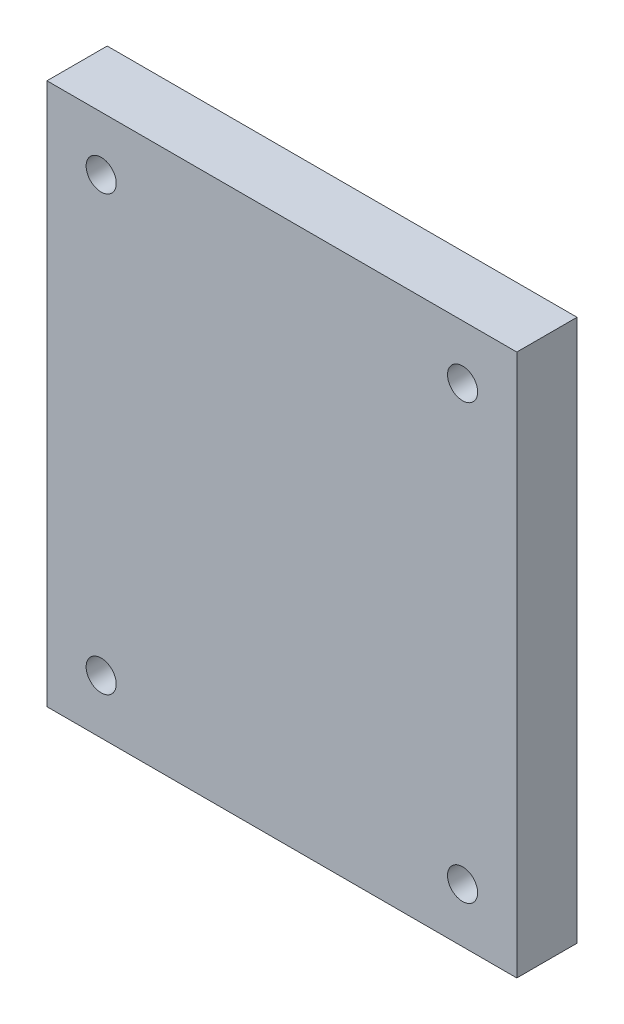
ISO-10303-21;
HEADER;
FILE_DESCRIPTION(('STEP AP214'),'2;1');
FILE_NAME('part.step','',(''),(''),'','','');
FILE_SCHEMA(('AUTOMOTIVE_DESIGN { 1 0 10303 214 1 1 1 1 }'));
ENDSEC;
DATA;
#1=APPLICATION_CONTEXT('core data for automotive mechanical design processes');
#2=APPLICATION_PROTOCOL_DEFINITION('international standard','automotive_design',2000,#1);
#3=PRODUCT_CONTEXT('',#1,'mechanical');
#4=PRODUCT('Part','Part','',(#3));
#5=PRODUCT_RELATED_PRODUCT_CATEGORY('part','',(#4));
#6=PRODUCT_DEFINITION_FORMATION('','',#4);
#7=PRODUCT_DEFINITION_CONTEXT('part definition',#1,'design');
#8=PRODUCT_DEFINITION('design','',#6,#7);
#9=PRODUCT_DEFINITION_SHAPE('','',#8);
#10=(LENGTH_UNIT() NAMED_UNIT(*) SI_UNIT(.MILLI.,.METRE.));
#11=(NAMED_UNIT(*) PLANE_ANGLE_UNIT() SI_UNIT($,.RADIAN.));
#12=(NAMED_UNIT(*) SI_UNIT($,.STERADIAN.) SOLID_ANGLE_UNIT());
#13=UNCERTAINTY_MEASURE_WITH_UNIT(LENGTH_MEASURE(1.E-05),#10,'distance_accuracy_value','');
#14=(GEOMETRIC_REPRESENTATION_CONTEXT(3) GLOBAL_UNCERTAINTY_ASSIGNED_CONTEXT((#13)) GLOBAL_UNIT_ASSIGNED_CONTEXT((#10,
#11,#12)) REPRESENTATION_CONTEXT('',''));
#15=CARTESIAN_POINT('',(0.,0.,0.));
#16=DIRECTION('',(0.,0.,1.));
#17=DIRECTION('',(1.,0.,0.));
#18=AXIS2_PLACEMENT_3D('',#15,#16,#17);
#19=CARTESIAN_POINT('',(19.5,0.,5.));
#20=DIRECTION('',(1.,0.,0.));
#21=DIRECTION('',(0.,0.,-1.));
#22=AXIS2_PLACEMENT_3D('',#19,#20,#21);
#23=PLANE('',#22);
#24=DIRECTION('',(0.,-1.,0.));
#25=VECTOR('',#24,1.);
#26=CARTESIAN_POINT('',(19.5,0.,0.));
#27=LINE('',#26,#25);
#28=CARTESIAN_POINT('',(19.5,22.5,0.));
#29=VERTEX_POINT('',#28);
#30=CARTESIAN_POINT('',(19.5,-22.5,0.));
#31=VERTEX_POINT('',#30);
#32=EDGE_CURVE('E113',#29,#31,#27,.T.);
#33=ORIENTED_EDGE('',*,*,#32,.F.);
#34=DIRECTION('',(0.,0.,-1.));
#35=VECTOR('',#34,1.);
#36=CARTESIAN_POINT('',(19.5,22.5,5.));
#37=LINE('',#36,#35);
#38=CARTESIAN_POINT('',(19.5,22.5,5.));
#39=VERTEX_POINT('',#38);
#40=EDGE_CURVE('E11',#39,#29,#37,.T.);
#41=ORIENTED_EDGE('',*,*,#40,.F.);
#42=DIRECTION('',(0.,-1.,0.));
#43=VECTOR('',#42,1.);
#44=CARTESIAN_POINT('',(19.5,0.,5.));
#45=LINE('',#44,#43);
#46=CARTESIAN_POINT('',(19.5,-22.5,5.));
#47=VERTEX_POINT('',#46);
#48=EDGE_CURVE('E94',#39,#47,#45,.T.);
#49=ORIENTED_EDGE('',*,*,#48,.T.);
#50=DIRECTION('',(0.,0.,-1.));
#51=VECTOR('',#50,1.);
#52=CARTESIAN_POINT('',(19.5,-22.5,5.));
#53=LINE('',#52,#51);
#54=EDGE_CURVE('E72',#47,#31,#53,.T.);
#55=ORIENTED_EDGE('',*,*,#54,.T.);
#56=EDGE_LOOP('',(#33,#41,#49,#55));
#57=FACE_BOUND('',#56,.T.);
#58=ADVANCED_FACE('F32',(#57),#23,.T.);
#59=CARTESIAN_POINT('',(0.,22.5,5.));
#60=DIRECTION('',(0.,1.,0.));
#61=DIRECTION('',(0.,0.,1.));
#62=AXIS2_PLACEMENT_3D('',#59,#60,#61);
#63=PLANE('',#62);
#64=DIRECTION('',(1.,0.,0.));
#65=VECTOR('',#64,1.);
#66=CARTESIAN_POINT('',(0.,22.5,0.));
#67=LINE('',#66,#65);
#68=CARTESIAN_POINT('',(-19.5,22.5,0.));
#69=VERTEX_POINT('',#68);
#70=EDGE_CURVE('E84',#69,#29,#67,.T.);
#71=ORIENTED_EDGE('',*,*,#70,.F.);
#72=DIRECTION('',(0.,0.,-1.));
#73=VECTOR('',#72,1.);
#74=CARTESIAN_POINT('',(-19.5,22.5,5.));
#75=LINE('',#74,#73);
#76=CARTESIAN_POINT('',(-19.5,22.5,5.));
#77=VERTEX_POINT('',#76);
#78=EDGE_CURVE('E41',#77,#69,#75,.T.);
#79=ORIENTED_EDGE('',*,*,#78,.F.);
#80=DIRECTION('',(1.,0.,0.));
#81=VECTOR('',#80,1.);
#82=CARTESIAN_POINT('',(0.,22.5,5.));
#83=LINE('',#82,#81);
#84=EDGE_CURVE('E82',#77,#39,#83,.T.);
#85=ORIENTED_EDGE('',*,*,#84,.T.);
#86=ORIENTED_EDGE('',*,*,#40,.T.);
#87=EDGE_LOOP('',(#71,#79,#85,#86));
#88=FACE_BOUND('',#87,.T.);
#89=ADVANCED_FACE('F80',(#88),#63,.T.);
#90=CARTESIAN_POINT('',(-19.5,0.,5.));
#91=DIRECTION('',(1.,0.,0.));
#92=DIRECTION('',(0.,0.,-1.));
#93=AXIS2_PLACEMENT_3D('',#90,#91,#92);
#94=PLANE('',#93);
#95=DIRECTION('',(0.,-1.,0.));
#96=VECTOR('',#95,1.);
#97=CARTESIAN_POINT('',(-19.5,0.,0.));
#98=LINE('',#97,#96);
#99=CARTESIAN_POINT('',(-19.5,-22.5,0.));
#100=VERTEX_POINT('',#99);
#101=EDGE_CURVE('E116',#69,#100,#98,.T.);
#102=ORIENTED_EDGE('',*,*,#101,.T.);
#103=DIRECTION('',(0.,0.,-1.));
#104=VECTOR('',#103,1.);
#105=CARTESIAN_POINT('',(-19.5,-22.5,5.));
#106=LINE('',#105,#104);
#107=CARTESIAN_POINT('',(-19.5,-22.5,5.));
#108=VERTEX_POINT('',#107);
#109=EDGE_CURVE('E87',#108,#100,#106,.T.);
#110=ORIENTED_EDGE('',*,*,#109,.F.);
#111=DIRECTION('',(0.,-1.,0.));
#112=VECTOR('',#111,1.);
#113=CARTESIAN_POINT('',(-19.5,0.,5.));
#114=LINE('',#113,#112);
#115=EDGE_CURVE('E89',#77,#108,#114,.T.);
#116=ORIENTED_EDGE('',*,*,#115,.F.);
#117=ORIENTED_EDGE('',*,*,#78,.T.);
#118=EDGE_LOOP('',(#102,#110,#116,#117));
#119=FACE_BOUND('',#118,.T.);
#120=ADVANCED_FACE('F90',(#119),#94,.F.);
#121=CARTESIAN_POINT('',(14.9999999999999,-18.,5.));
#122=DIRECTION('',(0.,0.,-1.));
#123=DIRECTION('',(-1.,0.,0.));
#124=AXIS2_PLACEMENT_3D('',#121,#122,#123);
#125=CYLINDRICAL_SURFACE('',#124,1.25);
#126=CARTESIAN_POINT('',(14.9999999999999,-18.,5.));
#127=DIRECTION('',(0.,0.,1.));
#128=DIRECTION('',(1.,0.,0.));
#129=AXIS2_PLACEMENT_3D('',#126,#127,#128);
#130=CIRCLE('',#129,1.25);
#131=CARTESIAN_POINT('',(16.2499999999999,-18.,5.));
#132=VERTEX_POINT('',#131);
#133=EDGE_CURVE('E101',#132,#132,#130,.T.);
#134=ORIENTED_EDGE('',*,*,#133,.T.);
#135=EDGE_LOOP('',(#134));
#136=FACE_BOUND('',#135,.T.);
#137=CARTESIAN_POINT('',(14.9999999999999,-18.,0.));
#138=DIRECTION('',(0.,0.,1.));
#139=DIRECTION('',(1.,0.,0.));
#140=AXIS2_PLACEMENT_3D('',#137,#138,#139);
#141=CIRCLE('',#140,1.25);
#142=CARTESIAN_POINT('',(16.2499999999999,-18.,0.));
#143=VERTEX_POINT('',#142);
#144=EDGE_CURVE('E119',#143,#143,#141,.T.);
#145=ORIENTED_EDGE('',*,*,#144,.F.);
#146=EDGE_LOOP('',(#145));
#147=FACE_BOUND('',#146,.T.);
#148=ADVANCED_FACE('F147',(#136,#147),#125,.F.);
#149=CARTESIAN_POINT('',(0.,-22.5,5.));
#150=DIRECTION('',(0.,1.,0.));
#151=DIRECTION('',(0.,0.,1.));
#152=AXIS2_PLACEMENT_3D('',#149,#150,#151);
#153=PLANE('',#152);
#154=DIRECTION('',(1.,0.,0.));
#155=VECTOR('',#154,1.);
#156=CARTESIAN_POINT('',(0.,-22.5,0.));
#157=LINE('',#156,#155);
#158=EDGE_CURVE('E65',#100,#31,#157,.T.);
#159=ORIENTED_EDGE('',*,*,#158,.T.);
#160=ORIENTED_EDGE('',*,*,#54,.F.);
#161=DIRECTION('',(1.,0.,0.));
#162=VECTOR('',#161,1.);
#163=CARTESIAN_POINT('',(0.,-22.5,5.));
#164=LINE('',#163,#162);
#165=EDGE_CURVE('E49',#108,#47,#164,.T.);
#166=ORIENTED_EDGE('',*,*,#165,.F.);
#167=ORIENTED_EDGE('',*,*,#109,.T.);
#168=EDGE_LOOP('',(#159,#160,#166,#167));
#169=FACE_BOUND('',#168,.T.);
#170=ADVANCED_FACE('F128',(#169),#153,.F.);
#171=CARTESIAN_POINT('',(-15.,18.,5.));
#172=DIRECTION('',(0.,0.,-1.));
#173=DIRECTION('',(-1.,0.,0.));
#174=AXIS2_PLACEMENT_3D('',#171,#172,#173);
#175=CYLINDRICAL_SURFACE('',#174,1.25);
#176=CARTESIAN_POINT('',(-15.,18.,5.));
#177=DIRECTION('',(0.,0.,1.));
#178=DIRECTION('',(1.,0.,0.));
#179=AXIS2_PLACEMENT_3D('',#176,#177,#178);
#180=CIRCLE('',#179,1.25);
#181=CARTESIAN_POINT('',(-13.75,18.,5.));
#182=VERTEX_POINT('',#181);
#183=EDGE_CURVE('E96',#182,#182,#180,.T.);
#184=ORIENTED_EDGE('',*,*,#183,.T.);
#185=EDGE_LOOP('',(#184));
#186=FACE_BOUND('',#185,.T.);
#187=CARTESIAN_POINT('',(-15.,18.,0.));
#188=DIRECTION('',(0.,0.,1.));
#189=DIRECTION('',(1.,0.,0.));
#190=AXIS2_PLACEMENT_3D('',#187,#188,#189);
#191=CIRCLE('',#190,1.25);
#192=CARTESIAN_POINT('',(-13.75,18.,0.));
#193=VERTEX_POINT('',#192);
#194=EDGE_CURVE('E110',#193,#193,#191,.T.);
#195=ORIENTED_EDGE('',*,*,#194,.F.);
#196=EDGE_LOOP('',(#195));
#197=FACE_BOUND('',#196,.T.);
#198=ADVANCED_FACE('F138',(#186,#197),#175,.F.);
#199=CARTESIAN_POINT('',(14.9999999999999,18.,5.));
#200=DIRECTION('',(0.,0.,-1.));
#201=DIRECTION('',(-1.,0.,0.));
#202=AXIS2_PLACEMENT_3D('',#199,#200,#201);
#203=CYLINDRICAL_SURFACE('',#202,1.25);
#204=CARTESIAN_POINT('',(14.9999999999999,18.,5.));
#205=DIRECTION('',(0.,0.,1.));
#206=DIRECTION('',(1.,0.,0.));
#207=AXIS2_PLACEMENT_3D('',#204,#205,#206);
#208=CIRCLE('',#207,1.25);
#209=CARTESIAN_POINT('',(16.2499999999999,18.,5.));
#210=VERTEX_POINT('',#209);
#211=EDGE_CURVE('E125',#210,#210,#208,.F.);
#212=ORIENTED_EDGE('',*,*,#211,.F.);
#213=EDGE_LOOP('',(#212));
#214=FACE_BOUND('',#213,.T.);
#215=CARTESIAN_POINT('',(14.9999999999999,18.,0.));
#216=DIRECTION('',(0.,0.,1.));
#217=DIRECTION('',(1.,0.,0.));
#218=AXIS2_PLACEMENT_3D('',#215,#216,#217);
#219=CIRCLE('',#218,1.25);
#220=CARTESIAN_POINT('',(16.2499999999999,18.,0.));
#221=VERTEX_POINT('',#220);
#222=EDGE_CURVE('E107',#221,#221,#219,.F.);
#223=ORIENTED_EDGE('',*,*,#222,.T.);
#224=EDGE_LOOP('',(#223));
#225=FACE_BOUND('',#224,.T.);
#226=ADVANCED_FACE('F34',(#214,#225),#203,.F.);
#227=CARTESIAN_POINT('',(-15.,-18.,5.));
#228=DIRECTION('',(0.,0.,-1.));
#229=DIRECTION('',(-1.,0.,0.));
#230=AXIS2_PLACEMENT_3D('',#227,#228,#229);
#231=CYLINDRICAL_SURFACE('',#230,1.25);
#232=CARTESIAN_POINT('',(-15.,-18.,5.));
#233=DIRECTION('',(0.,0.,1.));
#234=DIRECTION('',(1.,0.,0.));
#235=AXIS2_PLACEMENT_3D('',#232,#233,#234);
#236=CIRCLE('',#235,1.25);
#237=CARTESIAN_POINT('',(-13.75,-18.,5.));
#238=VERTEX_POINT('',#237);
#239=EDGE_CURVE('E104',#238,#238,#236,.F.);
#240=ORIENTED_EDGE('',*,*,#239,.F.);
#241=EDGE_LOOP('',(#240));
#242=FACE_BOUND('',#241,.T.);
#243=CARTESIAN_POINT('',(-15.,-18.,0.));
#244=DIRECTION('',(0.,0.,1.));
#245=DIRECTION('',(1.,0.,0.));
#246=AXIS2_PLACEMENT_3D('',#243,#244,#245);
#247=CIRCLE('',#246,1.25);
#248=CARTESIAN_POINT('',(-13.75,-18.,0.));
#249=VERTEX_POINT('',#248);
#250=EDGE_CURVE('E122',#249,#249,#247,.F.);
#251=ORIENTED_EDGE('',*,*,#250,.T.);
#252=EDGE_LOOP('',(#251));
#253=FACE_BOUND('',#252,.T.);
#254=ADVANCED_FACE('F145',(#242,#253),#231,.F.);
#255=CARTESIAN_POINT('',(0.,0.,5.));
#256=DIRECTION('',(0.,0.,1.));
#257=DIRECTION('',(1.,0.,0.));
#258=AXIS2_PLACEMENT_3D('',#255,#256,#257);
#259=PLANE('',#258);
#260=ORIENTED_EDGE('',*,*,#211,.T.);
#261=EDGE_LOOP('',(#260));
#262=FACE_BOUND('',#261,.T.);
#263=ORIENTED_EDGE('',*,*,#183,.F.);
#264=EDGE_LOOP('',(#263));
#265=FACE_BOUND('',#264,.T.);
#266=ORIENTED_EDGE('',*,*,#48,.F.);
#267=ORIENTED_EDGE('',*,*,#84,.F.);
#268=ORIENTED_EDGE('',*,*,#115,.T.);
#269=ORIENTED_EDGE('',*,*,#165,.T.);
#270=EDGE_LOOP('',(#266,#267,#268,#269));
#271=FACE_BOUND('',#270,.T.);
#272=ORIENTED_EDGE('',*,*,#133,.F.);
#273=EDGE_LOOP('',(#272));
#274=FACE_BOUND('',#273,.T.);
#275=ORIENTED_EDGE('',*,*,#239,.T.);
#276=EDGE_LOOP('',(#275));
#277=FACE_BOUND('',#276,.T.);
#278=ADVANCED_FACE('F92',(#262,#265,#271,#274,#277),#259,.T.);
#279=CARTESIAN_POINT('',(0.,0.,0.));
#280=DIRECTION('',(0.,0.,1.));
#281=DIRECTION('',(1.,0.,0.));
#282=AXIS2_PLACEMENT_3D('',#279,#280,#281);
#283=PLANE('',#282);
#284=ORIENTED_EDGE('',*,*,#222,.F.);
#285=EDGE_LOOP('',(#284));
#286=FACE_BOUND('',#285,.T.);
#287=ORIENTED_EDGE('',*,*,#194,.T.);
#288=EDGE_LOOP('',(#287));
#289=FACE_BOUND('',#288,.T.);
#290=ORIENTED_EDGE('',*,*,#32,.T.);
#291=ORIENTED_EDGE('',*,*,#158,.F.);
#292=ORIENTED_EDGE('',*,*,#101,.F.);
#293=ORIENTED_EDGE('',*,*,#70,.T.);
#294=EDGE_LOOP('',(#290,#291,#292,#293));
#295=FACE_BOUND('',#294,.T.);
#296=ORIENTED_EDGE('',*,*,#144,.T.);
#297=EDGE_LOOP('',(#296));
#298=FACE_BOUND('',#297,.T.);
#299=ORIENTED_EDGE('',*,*,#250,.F.);
#300=EDGE_LOOP('',(#299));
#301=FACE_BOUND('',#300,.T.);
#302=ADVANCED_FACE('F129',(#286,#289,#295,#298,#301),#283,.F.);
#303=CLOSED_SHELL('',(#58,#89,#120,#148,#170,#198,#226,#254,#278,#302));
#304=MANIFOLD_SOLID_BREP('B2',#303);
#305=ADVANCED_BREP_SHAPE_REPRESENTATION('',(#18,#304),#14);
#306=SHAPE_DEFINITION_REPRESENTATION(#9,#305);
ENDSEC;
END-ISO-10303-21;
